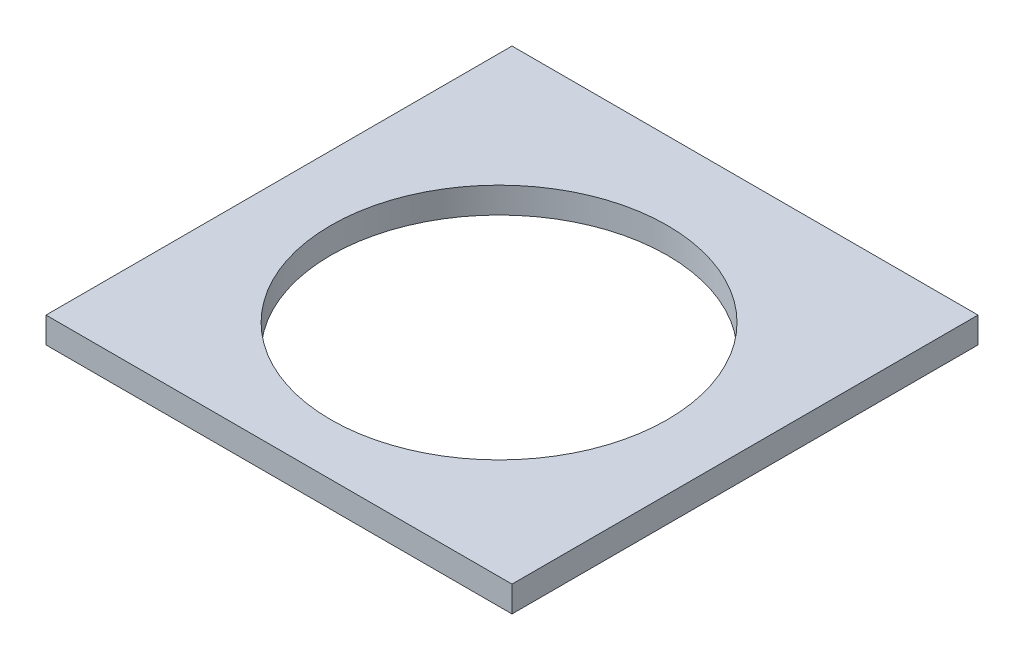
ISO-10303-21;
HEADER;
FILE_DESCRIPTION(('STEP AP214'),'2;1');
FILE_NAME('part.step','',(''),(''),'','','');
FILE_SCHEMA(('AUTOMOTIVE_DESIGN { 1 0 10303 214 1 1 1 1 }'));
ENDSEC;
DATA;
#1=APPLICATION_CONTEXT('core data for automotive mechanical design processes');
#2=APPLICATION_PROTOCOL_DEFINITION('international standard','automotive_design',2000,#1);
#3=PRODUCT_CONTEXT('',#1,'mechanical');
#4=PRODUCT('Part','Part','',(#3));
#5=PRODUCT_RELATED_PRODUCT_CATEGORY('part','',(#4));
#6=PRODUCT_DEFINITION_FORMATION('','',#4);
#7=PRODUCT_DEFINITION_CONTEXT('part definition',#1,'design');
#8=PRODUCT_DEFINITION('design','',#6,#7);
#9=PRODUCT_DEFINITION_SHAPE('','',#8);
#10=(LENGTH_UNIT() NAMED_UNIT(*) SI_UNIT(.MILLI.,.METRE.));
#11=(NAMED_UNIT(*) PLANE_ANGLE_UNIT() SI_UNIT($,.RADIAN.));
#12=(NAMED_UNIT(*) SI_UNIT($,.STERADIAN.) SOLID_ANGLE_UNIT());
#13=UNCERTAINTY_MEASURE_WITH_UNIT(LENGTH_MEASURE(1.E-05),#10,'distance_accuracy_value','');
#14=(GEOMETRIC_REPRESENTATION_CONTEXT(3) GLOBAL_UNCERTAINTY_ASSIGNED_CONTEXT((#13)) GLOBAL_UNIT_ASSIGNED_CONTEXT((#10,
#11,#12)) REPRESENTATION_CONTEXT('',''));
#15=CARTESIAN_POINT('',(0.,0.,0.));
#16=DIRECTION('',(0.,0.,1.));
#17=DIRECTION('',(1.,0.,0.));
#18=AXIS2_PLACEMENT_3D('',#15,#16,#17);
#19=CARTESIAN_POINT('',(-9.,9.,9.));
#20=DIRECTION('',(1.,0.,0.));
#21=DIRECTION('',(0.,0.,-1.));
#22=AXIS2_PLACEMENT_3D('',#19,#20,#21);
#23=PLANE('',#22);
#24=DIRECTION('',(0.,0.,1.));
#25=VECTOR('',#24,1.);
#26=CARTESIAN_POINT('',(-9.,8.,9.));
#27=LINE('',#26,#25);
#28=CARTESIAN_POINT('',(-9.,8.,-9.));
#29=VERTEX_POINT('',#28);
#30=CARTESIAN_POINT('',(-9.,8.,9.));
#31=VERTEX_POINT('',#30);
#32=EDGE_CURVE('E96',#29,#31,#27,.T.);
#33=ORIENTED_EDGE('',*,*,#32,.T.);
#34=DIRECTION('',(0.,-1.,0.));
#35=VECTOR('',#34,1.);
#36=CARTESIAN_POINT('',(-9.,9.,9.));
#37=LINE('',#36,#35);
#38=CARTESIAN_POINT('',(-9.,9.,9.));
#39=VERTEX_POINT('',#38);
#40=EDGE_CURVE('E11',#39,#31,#37,.T.);
#41=ORIENTED_EDGE('',*,*,#40,.F.);
#42=DIRECTION('',(0.,0.,1.));
#43=VECTOR('',#42,1.);
#44=CARTESIAN_POINT('',(-9.,9.,9.));
#45=LINE('',#44,#43);
#46=CARTESIAN_POINT('',(-9.,9.,-9.));
#47=VERTEX_POINT('',#46);
#48=EDGE_CURVE('E84',#47,#39,#45,.T.);
#49=ORIENTED_EDGE('',*,*,#48,.F.);
#50=DIRECTION('',(0.,-1.,0.));
#51=VECTOR('',#50,1.);
#52=CARTESIAN_POINT('',(-9.,9.,-9.));
#53=LINE('',#52,#51);
#54=EDGE_CURVE('E92',#47,#29,#53,.T.);
#55=ORIENTED_EDGE('',*,*,#54,.T.);
#56=EDGE_LOOP('',(#33,#41,#49,#55));
#57=FACE_BOUND('',#56,.T.);
#58=ADVANCED_FACE('F33',(#57),#23,.F.);
#59=CARTESIAN_POINT('',(9.,9.,9.));
#60=DIRECTION('',(0.,0.,-1.));
#61=DIRECTION('',(-1.,0.,0.));
#62=AXIS2_PLACEMENT_3D('',#59,#60,#61);
#63=PLANE('',#62);
#64=DIRECTION('',(1.,0.,0.));
#65=VECTOR('',#64,1.);
#66=CARTESIAN_POINT('',(9.,8.,9.));
#67=LINE('',#66,#65);
#68=CARTESIAN_POINT('',(9.,8.,9.));
#69=VERTEX_POINT('',#68);
#70=EDGE_CURVE('E88',#31,#69,#67,.T.);
#71=ORIENTED_EDGE('',*,*,#70,.T.);
#72=DIRECTION('',(0.,-1.,0.));
#73=VECTOR('',#72,1.);
#74=CARTESIAN_POINT('',(9.,9.,9.));
#75=LINE('',#74,#73);
#76=CARTESIAN_POINT('',(9.,9.,9.));
#77=VERTEX_POINT('',#76);
#78=EDGE_CURVE('E41',#77,#69,#75,.T.);
#79=ORIENTED_EDGE('',*,*,#78,.F.);
#80=DIRECTION('',(1.,0.,0.));
#81=VECTOR('',#80,1.);
#82=CARTESIAN_POINT('',(9.,9.,9.));
#83=LINE('',#82,#81);
#84=EDGE_CURVE('E79',#39,#77,#83,.T.);
#85=ORIENTED_EDGE('',*,*,#84,.F.);
#86=ORIENTED_EDGE('',*,*,#40,.T.);
#87=EDGE_LOOP('',(#71,#79,#85,#86));
#88=FACE_BOUND('',#87,.T.);
#89=ADVANCED_FACE('F87',(#88),#63,.F.);
#90=CARTESIAN_POINT('',(9.,9.,9.));
#91=DIRECTION('',(-1.,0.,0.));
#92=DIRECTION('',(0.,0.,1.));
#93=AXIS2_PLACEMENT_3D('',#90,#91,#92);
#94=PLANE('',#93);
#95=DIRECTION('',(0.,0.,-1.));
#96=VECTOR('',#95,1.);
#97=CARTESIAN_POINT('',(9.,8.,9.));
#98=LINE('',#97,#96);
#99=CARTESIAN_POINT('',(9.,8.,-9.));
#100=VERTEX_POINT('',#99);
#101=EDGE_CURVE('E66',#69,#100,#98,.T.);
#102=ORIENTED_EDGE('',*,*,#101,.T.);
#103=DIRECTION('',(0.,-1.,0.));
#104=VECTOR('',#103,1.);
#105=CARTESIAN_POINT('',(9.,9.,-9.));
#106=LINE('',#105,#104);
#107=CARTESIAN_POINT('',(9.,9.,-9.));
#108=VERTEX_POINT('',#107);
#109=EDGE_CURVE('E89',#108,#100,#106,.T.);
#110=ORIENTED_EDGE('',*,*,#109,.F.);
#111=DIRECTION('',(0.,0.,-1.));
#112=VECTOR('',#111,1.);
#113=CARTESIAN_POINT('',(9.,9.,9.));
#114=LINE('',#113,#112);
#115=EDGE_CURVE('E82',#77,#108,#114,.T.);
#116=ORIENTED_EDGE('',*,*,#115,.F.);
#117=ORIENTED_EDGE('',*,*,#78,.T.);
#118=EDGE_LOOP('',(#102,#110,#116,#117));
#119=FACE_BOUND('',#118,.T.);
#120=ADVANCED_FACE('F90',(#119),#94,.F.);
#121=CARTESIAN_POINT('',(9.,9.,-9.));
#122=DIRECTION('',(0.,0.,1.));
#123=DIRECTION('',(1.,0.,0.));
#124=AXIS2_PLACEMENT_3D('',#121,#122,#123);
#125=PLANE('',#124);
#126=DIRECTION('',(-1.,0.,0.));
#127=VECTOR('',#126,1.);
#128=CARTESIAN_POINT('',(9.,8.,-9.));
#129=LINE('',#128,#127);
#130=EDGE_CURVE('E72',#100,#29,#129,.T.);
#131=ORIENTED_EDGE('',*,*,#130,.T.);
#132=ORIENTED_EDGE('',*,*,#54,.F.);
#133=DIRECTION('',(-1.,0.,0.));
#134=VECTOR('',#133,1.);
#135=CARTESIAN_POINT('',(9.,9.,-9.));
#136=LINE('',#135,#134);
#137=EDGE_CURVE('E49',#108,#47,#136,.T.);
#138=ORIENTED_EDGE('',*,*,#137,.F.);
#139=ORIENTED_EDGE('',*,*,#109,.T.);
#140=EDGE_LOOP('',(#131,#132,#138,#139));
#141=FACE_BOUND('',#140,.T.);
#142=ADVANCED_FACE('F104',(#141),#125,.F.);
#143=CARTESIAN_POINT('',(0.,9.,0.));
#144=DIRECTION('',(0.,1.,0.));
#145=DIRECTION('',(0.,0.,1.));
#146=AXIS2_PLACEMENT_3D('',#143,#144,#145);
#147=PLANE('',#146);
#148=CARTESIAN_POINT('',(0.,9.,0.500000000000002));
#149=DIRECTION('',(0.,1.,0.));
#150=DIRECTION('',(0.,0.,1.));
#151=AXIS2_PLACEMENT_3D('',#148,#149,#150);
#152=CIRCLE('',#151,6.5);
#153=CARTESIAN_POINT('',(0.,9.,7.));
#154=VERTEX_POINT('',#153);
#155=EDGE_CURVE('E110',#154,#154,#152,.T.);
#156=ORIENTED_EDGE('',*,*,#155,.F.);
#157=EDGE_LOOP('',(#156));
#158=FACE_BOUND('',#157,.T.);
#159=ORIENTED_EDGE('',*,*,#48,.T.);
#160=ORIENTED_EDGE('',*,*,#84,.T.);
#161=ORIENTED_EDGE('',*,*,#115,.T.);
#162=ORIENTED_EDGE('',*,*,#137,.T.);
#163=EDGE_LOOP('',(#159,#160,#161,#162));
#164=FACE_BOUND('',#163,.T.);
#165=ADVANCED_FACE('F80',(#158,#164),#147,.T.);
#166=CARTESIAN_POINT('',(0.,8.,0.));
#167=DIRECTION('',(0.,1.,0.));
#168=DIRECTION('',(0.,0.,1.));
#169=AXIS2_PLACEMENT_3D('',#166,#167,#168);
#170=PLANE('',#169);
#171=CARTESIAN_POINT('',(0.,8.,0.500000000000002));
#172=DIRECTION('',(0.,1.,0.));
#173=DIRECTION('',(0.,0.,1.));
#174=AXIS2_PLACEMENT_3D('',#171,#172,#173);
#175=CIRCLE('',#174,6.5);
#176=CARTESIAN_POINT('',(0.,8.,7.));
#177=VERTEX_POINT('',#176);
#178=EDGE_CURVE('E99',#177,#177,#175,.T.);
#179=ORIENTED_EDGE('',*,*,#178,.T.);
#180=EDGE_LOOP('',(#179));
#181=FACE_BOUND('',#180,.T.);
#182=ORIENTED_EDGE('',*,*,#32,.F.);
#183=ORIENTED_EDGE('',*,*,#130,.F.);
#184=ORIENTED_EDGE('',*,*,#101,.F.);
#185=ORIENTED_EDGE('',*,*,#70,.F.);
#186=EDGE_LOOP('',(#182,#183,#184,#185));
#187=FACE_BOUND('',#186,.T.);
#188=ADVANCED_FACE('F107',(#181,#187),#170,.F.);
#189=CARTESIAN_POINT('',(0.,8.,0.500000000000002));
#190=DIRECTION('',(0.,1.,0.));
#191=DIRECTION('',(0.,0.,1.));
#192=AXIS2_PLACEMENT_3D('',#189,#190,#191);
#193=CYLINDRICAL_SURFACE('',#192,6.5);
#194=ORIENTED_EDGE('',*,*,#178,.F.);
#195=EDGE_LOOP('',(#194));
#196=FACE_BOUND('',#195,.T.);
#197=ORIENTED_EDGE('',*,*,#155,.T.);
#198=EDGE_LOOP('',(#197));
#199=FACE_BOUND('',#198,.T.);
#200=ADVANCED_FACE('F117',(#196,#199),#193,.F.);
#201=CLOSED_SHELL('',(#58,#89,#120,#142,#165,#188,#200));
#202=MANIFOLD_SOLID_BREP('B2',#201);
#203=ADVANCED_BREP_SHAPE_REPRESENTATION('',(#18,#202),#14);
#204=SHAPE_DEFINITION_REPRESENTATION(#9,#203);
ENDSEC;
END-ISO-10303-21;
